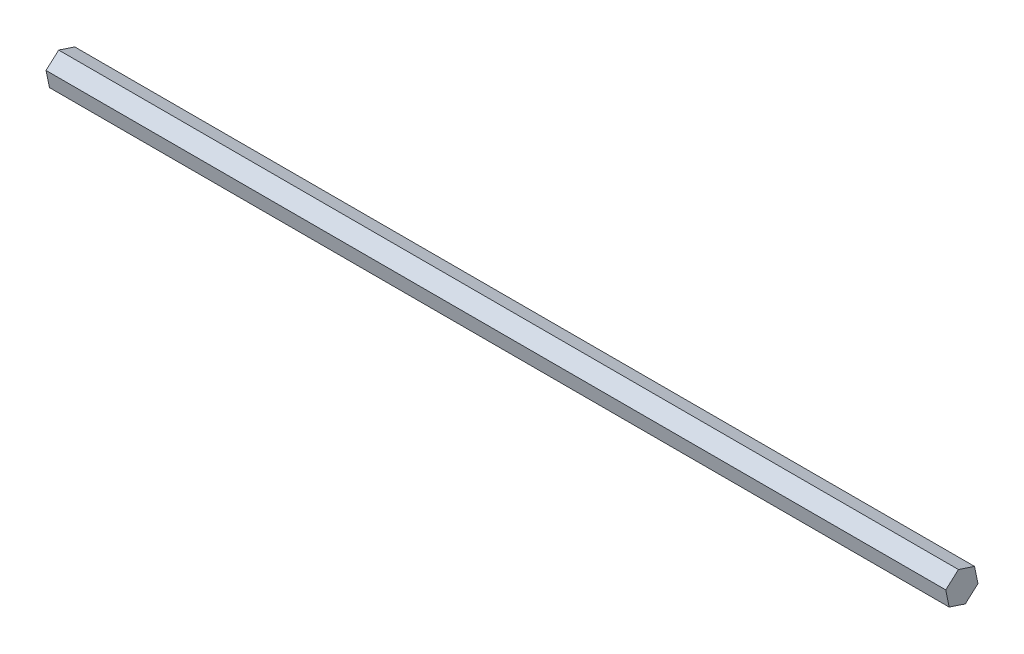
ISO-10303-21;
HEADER;
FILE_DESCRIPTION(('STEP AP214'),'2;1');
FILE_NAME('part.step','',(''),(''),'','','');
FILE_SCHEMA(('AUTOMOTIVE_DESIGN { 1 0 10303 214 1 1 1 1 }'));
ENDSEC;
DATA;
#1=APPLICATION_CONTEXT('core data for automotive mechanical design processes');
#2=APPLICATION_PROTOCOL_DEFINITION('international standard','automotive_design',2000,#1);
#3=PRODUCT_CONTEXT('',#1,'mechanical');
#4=PRODUCT('Part','Part','',(#3));
#5=PRODUCT_RELATED_PRODUCT_CATEGORY('part','',(#4));
#6=PRODUCT_DEFINITION_FORMATION('','',#4);
#7=PRODUCT_DEFINITION_CONTEXT('part definition',#1,'design');
#8=PRODUCT_DEFINITION('design','',#6,#7);
#9=PRODUCT_DEFINITION_SHAPE('','',#8);
#10=(LENGTH_UNIT() NAMED_UNIT(*) SI_UNIT(.MILLI.,.METRE.));
#11=(NAMED_UNIT(*) PLANE_ANGLE_UNIT() SI_UNIT($,.RADIAN.));
#12=(NAMED_UNIT(*) SI_UNIT($,.STERADIAN.) SOLID_ANGLE_UNIT());
#13=UNCERTAINTY_MEASURE_WITH_UNIT(LENGTH_MEASURE(1.E-05),#10,'distance_accuracy_value','');
#14=(GEOMETRIC_REPRESENTATION_CONTEXT(3) GLOBAL_UNCERTAINTY_ASSIGNED_CONTEXT((#13)) GLOBAL_UNIT_ASSIGNED_CONTEXT((#10,
#11,#12)) REPRESENTATION_CONTEXT('',''));
#15=CARTESIAN_POINT('',(0.,0.,0.));
#16=DIRECTION('',(0.,0.,1.));
#17=DIRECTION('',(1.,0.,0.));
#18=AXIS2_PLACEMENT_3D('',#15,#16,#17);
#19=CARTESIAN_POINT('',(388.62,-2.30149117758485,-6.96178653025446));
#20=DIRECTION('',(0.,-0.202901356263575,0.979199182815428));
#21=DIRECTION('',(0.,-0.979199182815428,-0.202901356263575));
#22=AXIS2_PLACEMENT_3D('',#19,#20,#21);
#23=PLANE('',#22);
#24=DIRECTION('',(0.,0.979199182815428,0.202901356263575));
#25=VECTOR('',#24,1.);
#26=CARTESIAN_POINT('',(0.,-2.30149117758485,-6.96178653025446));
#27=LINE('',#26,#25);
#28=CARTESIAN_POINT('',(0.,-2.30149117758485,-6.96178653025446));
#29=VERTEX_POINT('',#28);
#30=CARTESIAN_POINT('',(0.,4.87833840213225,-5.47404309150147));
#31=VERTEX_POINT('',#30);
#32=EDGE_CURVE('E117',#29,#31,#27,.T.);
#33=ORIENTED_EDGE('',*,*,#32,.T.);
#34=DIRECTION('',(-1.,0.,0.));
#35=VECTOR('',#34,1.);
#36=CARTESIAN_POINT('',(388.62,4.87833840213225,-5.47404309150147));
#37=LINE('',#36,#35);
#38=CARTESIAN_POINT('',(388.62,4.87833840213225,-5.47404309150147));
#39=VERTEX_POINT('',#38);
#40=EDGE_CURVE('E11',#39,#31,#37,.T.);
#41=ORIENTED_EDGE('',*,*,#40,.F.);
#42=DIRECTION('',(0.,0.979199182815428,0.202901356263575));
#43=VECTOR('',#42,1.);
#44=CARTESIAN_POINT('',(388.62,-2.30149117758485,-6.96178653025446));
#45=LINE('',#44,#43);
#46=CARTESIAN_POINT('',(388.62,-2.30149117758485,-6.96178653025446));
#47=VERTEX_POINT('',#46);
#48=EDGE_CURVE('E127',#47,#39,#45,.T.);
#49=ORIENTED_EDGE('',*,*,#48,.F.);
#50=DIRECTION('',(-1.,0.,0.));
#51=VECTOR('',#50,1.);
#52=CARTESIAN_POINT('',(388.62,-2.30149117758485,-6.96178653025446));
#53=LINE('',#52,#51);
#54=EDGE_CURVE('E113',#47,#29,#53,.T.);
#55=ORIENTED_EDGE('',*,*,#54,.T.);
#56=EDGE_LOOP('',(#33,#41,#49,#55));
#57=FACE_BOUND('',#56,.T.);
#58=ADVANCED_FACE('F33',(#57),#23,.F.);
#59=CARTESIAN_POINT('',(388.62,4.87833840213225,-5.47404309150147));
#60=DIRECTION('',(0.,-0.949462045814911,0.313881862421141));
#61=DIRECTION('',(0.,-0.313881862421141,-0.949462045814911));
#62=AXIS2_PLACEMENT_3D('',#59,#60,#61);
#63=PLANE('',#62);
#64=DIRECTION('',(0.,0.313881862421141,0.949462045814911));
#65=VECTOR('',#64,1.);
#66=CARTESIAN_POINT('',(0.,4.87833840213225,-5.47404309150147));
#67=LINE('',#66,#65);
#68=CARTESIAN_POINT('',(0.,7.17982957971711,1.48774343875298));
#69=VERTEX_POINT('',#68);
#70=EDGE_CURVE('E120',#31,#69,#67,.T.);
#71=ORIENTED_EDGE('',*,*,#70,.T.);
#72=DIRECTION('',(-1.,0.,0.));
#73=VECTOR('',#72,1.);
#74=CARTESIAN_POINT('',(388.62,7.17982957971711,1.48774343875298));
#75=LINE('',#74,#73);
#76=CARTESIAN_POINT('',(388.62,7.17982957971711,1.48774343875298));
#77=VERTEX_POINT('',#76);
#78=EDGE_CURVE('E41',#77,#69,#75,.T.);
#79=ORIENTED_EDGE('',*,*,#78,.F.);
#80=DIRECTION('',(0.,0.313881862421141,0.949462045814911));
#81=VECTOR('',#80,1.);
#82=CARTESIAN_POINT('',(388.62,4.87833840213225,-5.47404309150147));
#83=LINE('',#82,#81);
#84=EDGE_CURVE('E86',#39,#77,#83,.T.);
#85=ORIENTED_EDGE('',*,*,#84,.F.);
#86=ORIENTED_EDGE('',*,*,#40,.T.);
#87=EDGE_LOOP('',(#71,#79,#85,#86));
#88=FACE_BOUND('',#87,.T.);
#89=ADVANCED_FACE('F151',(#88),#63,.F.);
#90=CARTESIAN_POINT('',(388.62,7.17982957971711,1.48774343875298));
#91=DIRECTION('',(0.,-0.746560689551336,-0.665317320394287));
#92=DIRECTION('',(0.,0.665317320394287,-0.746560689551336));
#93=AXIS2_PLACEMENT_3D('',#90,#91,#92);
#94=PLANE('',#93);
#95=DIRECTION('',(0.,-0.665317320394287,0.746560689551336));
#96=VECTOR('',#95,1.);
#97=CARTESIAN_POINT('',(0.,7.17982957971711,1.48774343875298));
#98=LINE('',#97,#96);
#99=CARTESIAN_POINT('',(0.,2.30149117758485,6.96178653025446));
#100=VERTEX_POINT('',#99);
#101=EDGE_CURVE('E122',#69,#100,#98,.T.);
#102=ORIENTED_EDGE('',*,*,#101,.T.);
#103=DIRECTION('',(-1.,0.,0.));
#104=VECTOR('',#103,1.);
#105=CARTESIAN_POINT('',(388.62,2.30149117758485,6.96178653025446));
#106=LINE('',#105,#104);
#107=CARTESIAN_POINT('',(388.62,2.30149117758485,6.96178653025446));
#108=VERTEX_POINT('',#107);
#109=EDGE_CURVE('E108',#108,#100,#106,.T.);
#110=ORIENTED_EDGE('',*,*,#109,.F.);
#111=DIRECTION('',(0.,-0.665317320394287,0.746560689551336));
#112=VECTOR('',#111,1.);
#113=CARTESIAN_POINT('',(388.62,7.17982957971711,1.48774343875298));
#114=LINE('',#113,#112);
#115=EDGE_CURVE('E99',#77,#108,#114,.T.);
#116=ORIENTED_EDGE('',*,*,#115,.F.);
#117=ORIENTED_EDGE('',*,*,#78,.T.);
#118=EDGE_LOOP('',(#102,#110,#116,#117));
#119=FACE_BOUND('',#118,.T.);
#120=ADVANCED_FACE('F133',(#119),#94,.F.);
#121=CARTESIAN_POINT('',(388.62,2.30149117758485,6.96178653025446));
#122=DIRECTION('',(0.,0.202901356263575,-0.979199182815428));
#123=DIRECTION('',(0.,0.979199182815428,0.202901356263575));
#124=AXIS2_PLACEMENT_3D('',#121,#122,#123);
#125=PLANE('',#124);
#126=DIRECTION('',(0.,-0.979199182815428,-0.202901356263575));
#127=VECTOR('',#126,1.);
#128=CARTESIAN_POINT('',(0.,2.30149117758485,6.96178653025446));
#129=LINE('',#128,#127);
#130=CARTESIAN_POINT('',(0.,-4.87833840213226,5.47404309150147));
#131=VERTEX_POINT('',#130);
#132=EDGE_CURVE('E107',#100,#131,#129,.T.);
#133=ORIENTED_EDGE('',*,*,#132,.T.);
#134=DIRECTION('',(-1.,0.,0.));
#135=VECTOR('',#134,1.);
#136=CARTESIAN_POINT('',(388.62,-4.87833840213226,5.47404309150147));
#137=LINE('',#136,#135);
#138=CARTESIAN_POINT('',(388.62,-4.87833840213226,5.47404309150147));
#139=VERTEX_POINT('',#138);
#140=EDGE_CURVE('E104',#139,#131,#137,.T.);
#141=ORIENTED_EDGE('',*,*,#140,.F.);
#142=DIRECTION('',(0.,-0.979199182815428,-0.202901356263575));
#143=VECTOR('',#142,1.);
#144=CARTESIAN_POINT('',(388.62,2.30149117758485,6.96178653025446));
#145=LINE('',#144,#143);
#146=EDGE_CURVE('E93',#108,#139,#145,.T.);
#147=ORIENTED_EDGE('',*,*,#146,.F.);
#148=ORIENTED_EDGE('',*,*,#109,.T.);
#149=EDGE_LOOP('',(#133,#141,#147,#148));
#150=FACE_BOUND('',#149,.T.);
#151=ADVANCED_FACE('F105',(#150),#125,.F.);
#152=CARTESIAN_POINT('',(388.62,-4.87833840213226,5.47404309150147));
#153=DIRECTION('',(0.,0.949462045814911,-0.313881862421141));
#154=DIRECTION('',(0.,0.313881862421141,0.949462045814911));
#155=AXIS2_PLACEMENT_3D('',#152,#153,#154);
#156=PLANE('',#155);
#157=DIRECTION('',(0.,-0.313881862421141,-0.949462045814911));
#158=VECTOR('',#157,1.);
#159=CARTESIAN_POINT('',(0.,-4.87833840213226,5.47404309150147));
#160=LINE('',#159,#158);
#161=CARTESIAN_POINT('',(0.,-7.17982957971711,-1.48774343875298));
#162=VERTEX_POINT('',#161);
#163=EDGE_CURVE('E72',#131,#162,#160,.T.);
#164=ORIENTED_EDGE('',*,*,#163,.T.);
#165=DIRECTION('',(-1.,0.,0.));
#166=VECTOR('',#165,1.);
#167=CARTESIAN_POINT('',(388.62,-7.17982957971711,-1.48774343875298));
#168=LINE('',#167,#166);
#169=CARTESIAN_POINT('',(388.62,-7.17982957971711,-1.48774343875298));
#170=VERTEX_POINT('',#169);
#171=EDGE_CURVE('E109',#170,#162,#168,.T.);
#172=ORIENTED_EDGE('',*,*,#171,.F.);
#173=DIRECTION('',(0.,-0.313881862421141,-0.949462045814911));
#174=VECTOR('',#173,1.);
#175=CARTESIAN_POINT('',(388.62,-4.87833840213226,5.47404309150147));
#176=LINE('',#175,#174);
#177=EDGE_CURVE('E97',#139,#170,#176,.T.);
#178=ORIENTED_EDGE('',*,*,#177,.F.);
#179=ORIENTED_EDGE('',*,*,#140,.T.);
#180=EDGE_LOOP('',(#164,#172,#178,#179));
#181=FACE_BOUND('',#180,.T.);
#182=ADVANCED_FACE('F111',(#181),#156,.F.);
#183=CARTESIAN_POINT('',(388.62,-7.17982957971711,-1.48774343875298));
#184=DIRECTION('',(0.,0.746560689551336,0.665317320394287));
#185=DIRECTION('',(0.,-0.665317320394287,0.746560689551336));
#186=AXIS2_PLACEMENT_3D('',#183,#184,#185);
#187=PLANE('',#186);
#188=DIRECTION('',(0.,0.665317320394287,-0.746560689551336));
#189=VECTOR('',#188,1.);
#190=CARTESIAN_POINT('',(0.,-7.17982957971711,-1.48774343875298));
#191=LINE('',#190,#189);
#192=EDGE_CURVE('E78',#162,#29,#191,.T.);
#193=ORIENTED_EDGE('',*,*,#192,.T.);
#194=ORIENTED_EDGE('',*,*,#54,.F.);
#195=DIRECTION('',(0.,0.665317320394287,-0.746560689551336));
#196=VECTOR('',#195,1.);
#197=CARTESIAN_POINT('',(388.62,-7.17982957971711,-1.48774343875298));
#198=LINE('',#197,#196);
#199=EDGE_CURVE('E49',#170,#47,#198,.T.);
#200=ORIENTED_EDGE('',*,*,#199,.F.);
#201=ORIENTED_EDGE('',*,*,#171,.T.);
#202=EDGE_LOOP('',(#193,#194,#200,#201));
#203=FACE_BOUND('',#202,.T.);
#204=ADVANCED_FACE('F140',(#203),#187,.F.);
#205=CARTESIAN_POINT('',(388.62,0.,0.));
#206=DIRECTION('',(1.,0.,0.));
#207=DIRECTION('',(0.,0.,-1.));
#208=AXIS2_PLACEMENT_3D('',#205,#206,#207);
#209=PLANE('',#208);
#210=ORIENTED_EDGE('',*,*,#48,.T.);
#211=ORIENTED_EDGE('',*,*,#84,.T.);
#212=ORIENTED_EDGE('',*,*,#115,.T.);
#213=ORIENTED_EDGE('',*,*,#146,.T.);
#214=ORIENTED_EDGE('',*,*,#177,.T.);
#215=ORIENTED_EDGE('',*,*,#199,.T.);
#216=EDGE_LOOP('',(#210,#211,#212,#213,#214,#215));
#217=FACE_BOUND('',#216,.T.);
#218=ADVANCED_FACE('F95',(#217),#209,.T.);
#219=CARTESIAN_POINT('',(0.,0.,0.));
#220=DIRECTION('',(1.,0.,0.));
#221=DIRECTION('',(0.,0.,-1.));
#222=AXIS2_PLACEMENT_3D('',#219,#220,#221);
#223=PLANE('',#222);
#224=ORIENTED_EDGE('',*,*,#32,.F.);
#225=ORIENTED_EDGE('',*,*,#192,.F.);
#226=ORIENTED_EDGE('',*,*,#163,.F.);
#227=ORIENTED_EDGE('',*,*,#132,.F.);
#228=ORIENTED_EDGE('',*,*,#101,.F.);
#229=ORIENTED_EDGE('',*,*,#70,.F.);
#230=EDGE_LOOP('',(#224,#225,#226,#227,#228,#229));
#231=FACE_BOUND('',#230,.T.);
#232=ADVANCED_FACE('F136',(#231),#223,.F.);
#233=CLOSED_SHELL('',(#58,#89,#120,#151,#182,#204,#218,#232));
#234=MANIFOLD_SOLID_BREP('B2',#233);
#235=ADVANCED_BREP_SHAPE_REPRESENTATION('',(#18,#234),#14);
#236=SHAPE_DEFINITION_REPRESENTATION(#9,#235);
ENDSEC;
END-ISO-10303-21;
